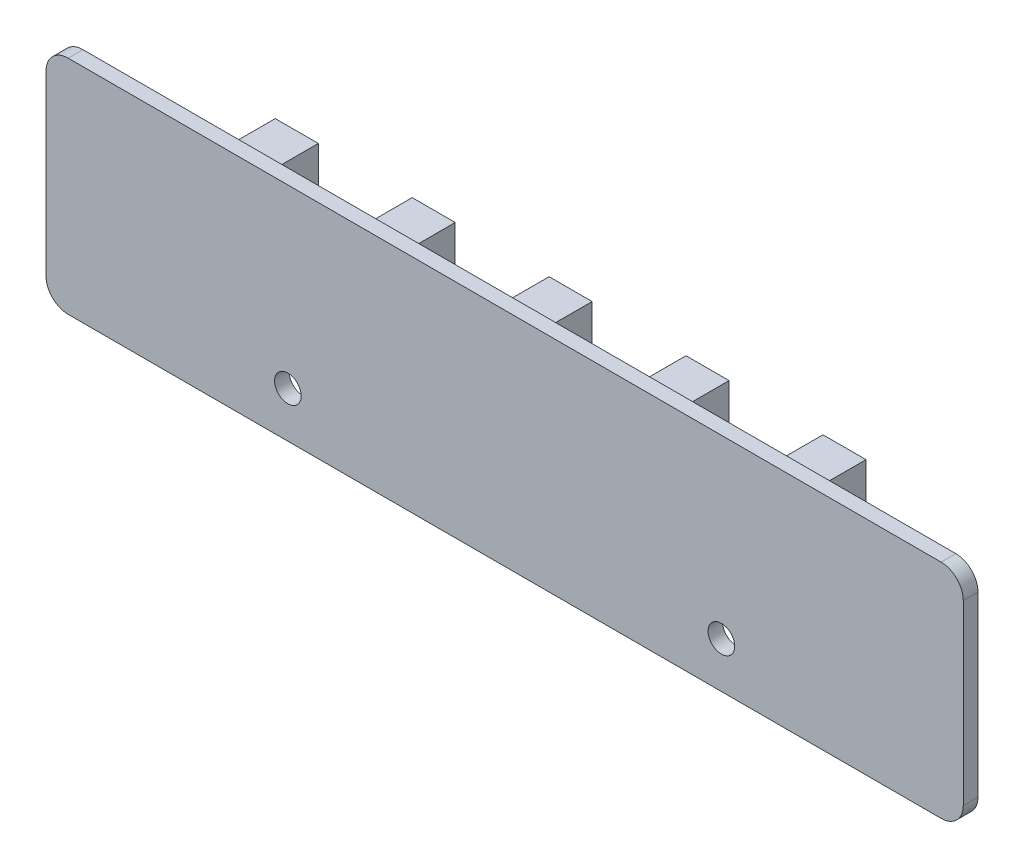
ISO-10303-21;
HEADER;
FILE_DESCRIPTION(('STEP AP214'),'2;1');
FILE_NAME('part.step','',(''),(''),'','','');
FILE_SCHEMA(('AUTOMOTIVE_DESIGN { 1 0 10303 214 1 1 1 1 }'));
ENDSEC;
DATA;
#1=APPLICATION_CONTEXT('core data for automotive mechanical design processes');
#2=APPLICATION_PROTOCOL_DEFINITION('international standard','automotive_design',2000,#1);
#3=PRODUCT_CONTEXT('',#1,'mechanical');
#4=PRODUCT('Part','Part','',(#3));
#5=PRODUCT_RELATED_PRODUCT_CATEGORY('part','',(#4));
#6=PRODUCT_DEFINITION_FORMATION('','',#4);
#7=PRODUCT_DEFINITION_CONTEXT('part definition',#1,'design');
#8=PRODUCT_DEFINITION('design','',#6,#7);
#9=PRODUCT_DEFINITION_SHAPE('','',#8);
#10=(LENGTH_UNIT() NAMED_UNIT(*) SI_UNIT(.MILLI.,.METRE.));
#11=(NAMED_UNIT(*) PLANE_ANGLE_UNIT() SI_UNIT($,.RADIAN.));
#12=(NAMED_UNIT(*) SI_UNIT($,.STERADIAN.) SOLID_ANGLE_UNIT());
#13=UNCERTAINTY_MEASURE_WITH_UNIT(LENGTH_MEASURE(1.E-05),#10,'distance_accuracy_value','');
#14=(GEOMETRIC_REPRESENTATION_CONTEXT(3) GLOBAL_UNCERTAINTY_ASSIGNED_CONTEXT((#13)) GLOBAL_UNIT_ASSIGNED_CONTEXT((#10,
#11,#12)) REPRESENTATION_CONTEXT('',''));
#15=CARTESIAN_POINT('',(0.,0.,0.));
#16=DIRECTION('',(0.,0.,1.));
#17=DIRECTION('',(1.,0.,0.));
#18=AXIS2_PLACEMENT_3D('',#15,#16,#17);
#19=CARTESIAN_POINT('',(-46.628094050939,74.0595570288471,1.99));
#20=DIRECTION('',(0.,0.,1.));
#21=DIRECTION('',(1.,0.,0.));
#22=AXIS2_PLACEMENT_3D('',#19,#20,#21);
#23=PLANE('',#22);
#24=CARTESIAN_POINT('',(-16.928094050939,53.2395570288471,1.99));
#25=DIRECTION('',(0.,0.,-1.));
#26=DIRECTION('',(-1.,0.,0.));
#27=AXIS2_PLACEMENT_3D('',#24,#25,#26);
#28=CIRCLE('',#27,1.8);
#29=CARTESIAN_POINT('',(-18.728094050939,53.2395570288471,1.99));
#30=VERTEX_POINT('',#29);
#31=EDGE_CURVE('E770',#30,#30,#28,.T.);
#32=ORIENTED_EDGE('',*,*,#31,.T.);
#33=EDGE_LOOP('',(#32));
#34=FACE_BOUND('',#33,.T.);
#35=CARTESIAN_POINT('',(-46.628094050939,74.0595570288471,1.99));
#36=DIRECTION('',(0.,0.,1.));
#37=DIRECTION('',(1.,0.,0.));
#38=AXIS2_PLACEMENT_3D('',#35,#36,#37);
#39=CIRCLE('',#38,3.);
#40=CARTESIAN_POINT('',(-46.628094050939,77.0595570288471,1.99));
#41=VERTEX_POINT('',#40);
#42=CARTESIAN_POINT('',(-49.628094050939,74.0595570288471,1.99));
#43=VERTEX_POINT('',#42);
#44=EDGE_CURVE('E382',#41,#43,#39,.T.);
#45=ORIENTED_EDGE('',*,*,#44,.T.);
#46=DIRECTION('',(0.,-1.,0.));
#47=VECTOR('',#46,1.);
#48=CARTESIAN_POINT('',(-49.628094050939,74.0595570288471,1.99));
#49=LINE('',#48,#47);
#50=CARTESIAN_POINT('',(-49.628094050939,50.0595570288472,1.99));
#51=VERTEX_POINT('',#50);
#52=EDGE_CURVE('E385',#43,#51,#49,.T.);
#53=ORIENTED_EDGE('',*,*,#52,.T.);
#54=CARTESIAN_POINT('',(-46.628094050939,50.0595570288471,1.99));
#55=DIRECTION('',(0.,0.,1.));
#56=DIRECTION('',(1.,0.,0.));
#57=AXIS2_PLACEMENT_3D('',#54,#55,#56);
#58=CIRCLE('',#57,3.);
#59=CARTESIAN_POINT('',(-46.6280940509389,47.0595570288471,1.99));
#60=VERTEX_POINT('',#59);
#61=EDGE_CURVE('E388',#51,#60,#58,.T.);
#62=ORIENTED_EDGE('',*,*,#61,.T.);
#63=DIRECTION('',(1.,0.,0.));
#64=VECTOR('',#63,1.);
#65=CARTESIAN_POINT('',(-46.6280940509389,47.0595570288471,1.99));
#66=LINE('',#65,#64);
#67=CARTESIAN_POINT('',(71.371905949061,47.0595570288471,1.99));
#68=VERTEX_POINT('',#67);
#69=EDGE_CURVE('E390',#60,#68,#66,.T.);
#70=ORIENTED_EDGE('',*,*,#69,.T.);
#71=CARTESIAN_POINT('',(71.371905949061,50.0595570288471,1.99));
#72=DIRECTION('',(0.,0.,1.));
#73=DIRECTION('',(1.,0.,0.));
#74=AXIS2_PLACEMENT_3D('',#71,#72,#73);
#75=CIRCLE('',#74,3.);
#76=CARTESIAN_POINT('',(74.371905949061,50.0595570288472,1.99));
#77=VERTEX_POINT('',#76);
#78=EDGE_CURVE('E392',#68,#77,#75,.T.);
#79=ORIENTED_EDGE('',*,*,#78,.T.);
#80=DIRECTION('',(0.,-1.,0.));
#81=VECTOR('',#80,1.);
#82=CARTESIAN_POINT('',(74.371905949061,74.0595570288471,1.99));
#83=LINE('',#82,#81);
#84=CARTESIAN_POINT('',(74.371905949061,74.0595570288471,1.99));
#85=VERTEX_POINT('',#84);
#86=EDGE_CURVE('E394',#85,#77,#83,.T.);
#87=ORIENTED_EDGE('',*,*,#86,.F.);
#88=CARTESIAN_POINT('',(71.371905949061,74.0595570288471,1.99));
#89=DIRECTION('',(0.,0.,-1.));
#90=DIRECTION('',(-1.,0.,0.));
#91=AXIS2_PLACEMENT_3D('',#88,#89,#90);
#92=CIRCLE('',#91,3.);
#93=CARTESIAN_POINT('',(71.371905949061,77.0595570288471,1.99));
#94=VERTEX_POINT('',#93);
#95=EDGE_CURVE('E397',#94,#85,#92,.T.);
#96=ORIENTED_EDGE('',*,*,#95,.F.);
#97=DIRECTION('',(1.,0.,0.));
#98=VECTOR('',#97,1.);
#99=CARTESIAN_POINT('',(-46.628094050939,77.0595570288471,1.99));
#100=LINE('',#99,#98);
#101=EDGE_CURVE('E400',#41,#94,#100,.T.);
#102=ORIENTED_EDGE('',*,*,#101,.F.);
#103=EDGE_LOOP('',(#45,#53,#62,#70,#79,#87,#96,#102));
#104=FACE_BOUND('',#103,.T.);
#105=CARTESIAN_POINT('',(41.671905949061,53.2395570288471,1.99));
#106=DIRECTION('',(0.,0.,-1.));
#107=DIRECTION('',(-1.,0.,0.));
#108=AXIS2_PLACEMENT_3D('',#105,#106,#107);
#109=CIRCLE('',#108,1.8);
#110=CARTESIAN_POINT('',(39.871905949061,53.2395570288471,1.99));
#111=VERTEX_POINT('',#110);
#112=EDGE_CURVE('E780',#111,#111,#109,.T.);
#113=ORIENTED_EDGE('',*,*,#112,.T.);
#114=EDGE_LOOP('',(#113));
#115=FACE_BOUND('',#114,.T.);
#116=ADVANCED_FACE('F38',(#34,#104,#115),#23,.T.);
#117=CARTESIAN_POINT('',(-46.628094050939,74.0595570288471,0.));
#118=DIRECTION('',(0.,0.,1.));
#119=DIRECTION('',(1.,0.,0.));
#120=AXIS2_PLACEMENT_3D('',#117,#118,#119);
#121=PLANE('',#120);
#122=CARTESIAN_POINT('',(-16.928094050939,53.2395570288471,0.));
#123=DIRECTION('',(0.,0.,-1.));
#124=DIRECTION('',(-1.,0.,0.));
#125=AXIS2_PLACEMENT_3D('',#122,#123,#124);
#126=CIRCLE('',#125,1.8);
#127=CARTESIAN_POINT('',(-18.728094050939,53.2395570288471,0.));
#128=VERTEX_POINT('',#127);
#129=EDGE_CURVE('E773',#128,#128,#126,.T.);
#130=ORIENTED_EDGE('',*,*,#129,.F.);
#131=EDGE_LOOP('',(#130));
#132=FACE_BOUND('',#131,.T.);
#133=CARTESIAN_POINT('',(41.671905949061,53.2395570288471,0.));
#134=DIRECTION('',(0.,0.,-1.));
#135=DIRECTION('',(-1.,0.,0.));
#136=AXIS2_PLACEMENT_3D('',#133,#134,#135);
#137=CIRCLE('',#136,1.8);
#138=CARTESIAN_POINT('',(39.871905949061,53.2395570288471,0.));
#139=VERTEX_POINT('',#138);
#140=EDGE_CURVE('E775',#139,#139,#137,.T.);
#141=ORIENTED_EDGE('',*,*,#140,.F.);
#142=EDGE_LOOP('',(#141));
#143=FACE_BOUND('',#142,.T.);
#144=DIRECTION('',(0.,-1.,0.));
#145=VECTOR('',#144,1.);
#146=CARTESIAN_POINT('',(33.790905949061,75.0595570288471,0.));
#147=LINE('',#146,#145);
#148=CARTESIAN_POINT('',(33.790905949061,75.0595570288471,0.));
#149=VERTEX_POINT('',#148);
#150=CARTESIAN_POINT('',(33.790905949061,65.4295570288471,0.));
#151=VERTEX_POINT('',#150);
#152=EDGE_CURVE('E279',#149,#151,#147,.T.);
#153=ORIENTED_EDGE('',*,*,#152,.F.);
#154=DIRECTION('',(1.,0.,0.));
#155=VECTOR('',#154,1.);
#156=CARTESIAN_POINT('',(33.790905949061,75.0595570288471,0.));
#157=LINE('',#156,#155);
#158=CARTESIAN_POINT('',(27.970905949061,75.0595570288471,0.));
#159=VERTEX_POINT('',#158);
#160=EDGE_CURVE('E245',#159,#149,#157,.T.);
#161=ORIENTED_EDGE('',*,*,#160,.F.);
#162=DIRECTION('',(0.,1.,0.));
#163=VECTOR('',#162,1.);
#164=CARTESIAN_POINT('',(27.970905949061,75.0595570288471,0.));
#165=LINE('',#164,#163);
#166=CARTESIAN_POINT('',(27.970905949061,65.4295570288471,0.));
#167=VERTEX_POINT('',#166);
#168=EDGE_CURVE('E267',#167,#159,#165,.T.);
#169=ORIENTED_EDGE('',*,*,#168,.F.);
#170=DIRECTION('',(-1.,0.,0.));
#171=VECTOR('',#170,1.);
#172=CARTESIAN_POINT('',(33.790905949061,65.4295570288471,0.));
#173=LINE('',#172,#171);
#174=EDGE_CURVE('E273',#151,#167,#173,.T.);
#175=ORIENTED_EDGE('',*,*,#174,.F.);
#176=EDGE_LOOP('',(#153,#161,#169,#175));
#177=FACE_BOUND('',#176,.T.);
#178=DIRECTION('',(0.,-1.,0.));
#179=VECTOR('',#178,1.);
#180=CARTESIAN_POINT('',(-3.22709405093898,75.0595570288471,0.));
#181=LINE('',#180,#179);
#182=CARTESIAN_POINT('',(-3.22709405093898,75.0595570288471,0.));
#183=VERTEX_POINT('',#182);
#184=CARTESIAN_POINT('',(-3.22709405093898,65.4295570288471,0.));
#185=VERTEX_POINT('',#184);
#186=EDGE_CURVE('E345',#183,#185,#181,.T.);
#187=ORIENTED_EDGE('',*,*,#186,.F.);
#188=DIRECTION('',(1.,0.,0.));
#189=VECTOR('',#188,1.);
#190=CARTESIAN_POINT('',(-3.22709405093898,75.0595570288471,0.));
#191=LINE('',#190,#189);
#192=CARTESIAN_POINT('',(-9.04709405093898,75.0595570288471,0.));
#193=VERTEX_POINT('',#192);
#194=EDGE_CURVE('E315',#193,#183,#191,.T.);
#195=ORIENTED_EDGE('',*,*,#194,.F.);
#196=DIRECTION('',(0.,1.,0.));
#197=VECTOR('',#196,1.);
#198=CARTESIAN_POINT('',(-9.04709405093898,75.0595570288471,0.));
#199=LINE('',#198,#197);
#200=CARTESIAN_POINT('',(-9.04709405093898,65.4295570288471,0.));
#201=VERTEX_POINT('',#200);
#202=EDGE_CURVE('E333',#201,#193,#199,.T.);
#203=ORIENTED_EDGE('',*,*,#202,.F.);
#204=DIRECTION('',(-1.,0.,0.));
#205=VECTOR('',#204,1.);
#206=CARTESIAN_POINT('',(-3.22709405093898,65.4295570288471,0.));
#207=LINE('',#206,#205);
#208=EDGE_CURVE('E339',#185,#201,#207,.T.);
#209=ORIENTED_EDGE('',*,*,#208,.F.);
#210=EDGE_LOOP('',(#187,#195,#203,#209));
#211=FACE_BOUND('',#210,.T.);
#212=CARTESIAN_POINT('',(-46.628094050939,74.0595570288471,0.));
#213=DIRECTION('',(0.,0.,1.));
#214=DIRECTION('',(1.,0.,0.));
#215=AXIS2_PLACEMENT_3D('',#212,#213,#214);
#216=CIRCLE('',#215,3.);
#217=CARTESIAN_POINT('',(-46.628094050939,77.0595570288471,0.));
#218=VERTEX_POINT('',#217);
#219=CARTESIAN_POINT('',(-49.628094050939,74.0595570288471,0.));
#220=VERTEX_POINT('',#219);
#221=EDGE_CURVE('E381',#218,#220,#216,.T.);
#222=ORIENTED_EDGE('',*,*,#221,.F.);
#223=DIRECTION('',(1.,0.,0.));
#224=VECTOR('',#223,1.);
#225=CARTESIAN_POINT('',(-46.628094050939,77.0595570288471,0.));
#226=LINE('',#225,#224);
#227=CARTESIAN_POINT('',(71.371905949061,77.0595570288471,0.));
#228=VERTEX_POINT('',#227);
#229=EDGE_CURVE('E386',#218,#228,#226,.T.);
#230=ORIENTED_EDGE('',*,*,#229,.T.);
#231=CARTESIAN_POINT('',(71.371905949061,74.0595570288471,0.));
#232=DIRECTION('',(0.,0.,-1.));
#233=DIRECTION('',(-1.,0.,0.));
#234=AXIS2_PLACEMENT_3D('',#231,#232,#233);
#235=CIRCLE('',#234,3.);
#236=CARTESIAN_POINT('',(74.371905949061,74.0595570288471,0.));
#237=VERTEX_POINT('',#236);
#238=EDGE_CURVE('E418',#228,#237,#235,.T.);
#239=ORIENTED_EDGE('',*,*,#238,.T.);
#240=DIRECTION('',(0.,-1.,0.));
#241=VECTOR('',#240,1.);
#242=CARTESIAN_POINT('',(74.371905949061,74.0595570288471,0.));
#243=LINE('',#242,#241);
#244=CARTESIAN_POINT('',(74.371905949061,50.0595570288472,0.));
#245=VERTEX_POINT('',#244);
#246=EDGE_CURVE('E415',#237,#245,#243,.T.);
#247=ORIENTED_EDGE('',*,*,#246,.T.);
#248=CARTESIAN_POINT('',(71.371905949061,50.0595570288471,0.));
#249=DIRECTION('',(0.,0.,1.));
#250=DIRECTION('',(1.,0.,0.));
#251=AXIS2_PLACEMENT_3D('',#248,#249,#250);
#252=CIRCLE('',#251,3.);
#253=CARTESIAN_POINT('',(71.371905949061,47.0595570288471,0.));
#254=VERTEX_POINT('',#253);
#255=EDGE_CURVE('E412',#254,#245,#252,.T.);
#256=ORIENTED_EDGE('',*,*,#255,.F.);
#257=DIRECTION('',(1.,0.,0.));
#258=VECTOR('',#257,1.);
#259=CARTESIAN_POINT('',(-46.6280940509389,47.0595570288471,0.));
#260=LINE('',#259,#258);
#261=CARTESIAN_POINT('',(-46.6280940509389,47.0595570288471,0.));
#262=VERTEX_POINT('',#261);
#263=EDGE_CURVE('E410',#262,#254,#260,.T.);
#264=ORIENTED_EDGE('',*,*,#263,.F.);
#265=CARTESIAN_POINT('',(-46.628094050939,50.0595570288471,0.));
#266=DIRECTION('',(0.,0.,1.));
#267=DIRECTION('',(1.,0.,0.));
#268=AXIS2_PLACEMENT_3D('',#265,#266,#267);
#269=CIRCLE('',#268,3.);
#270=CARTESIAN_POINT('',(-49.628094050939,50.0595570288472,0.));
#271=VERTEX_POINT('',#270);
#272=EDGE_CURVE('E408',#271,#262,#269,.T.);
#273=ORIENTED_EDGE('',*,*,#272,.F.);
#274=DIRECTION('',(0.,-1.,0.));
#275=VECTOR('',#274,1.);
#276=CARTESIAN_POINT('',(-49.628094050939,74.0595570288471,0.));
#277=LINE('',#276,#275);
#278=EDGE_CURVE('E406',#220,#271,#277,.T.);
#279=ORIENTED_EDGE('',*,*,#278,.F.);
#280=EDGE_LOOP('',(#222,#230,#239,#247,#256,#264,#273,#279));
#281=FACE_BOUND('',#280,.T.);
#282=DIRECTION('',(0.,-1.,0.));
#283=VECTOR('',#282,1.);
#284=CARTESIAN_POINT('',(15.281905949061,75.0595570288471,0.));
#285=LINE('',#284,#283);
#286=CARTESIAN_POINT('',(15.281905949061,75.0595570288471,0.));
#287=VERTEX_POINT('',#286);
#288=CARTESIAN_POINT('',(15.281905949061,65.4295570288471,0.));
#289=VERTEX_POINT('',#288);
#290=EDGE_CURVE('E348',#287,#289,#285,.T.);
#291=ORIENTED_EDGE('',*,*,#290,.F.);
#292=DIRECTION('',(1.,0.,0.));
#293=VECTOR('',#292,1.);
#294=CARTESIAN_POINT('',(15.281905949061,75.0595570288471,0.));
#295=LINE('',#294,#293);
#296=CARTESIAN_POINT('',(9.46190594906102,75.0595570288471,0.));
#297=VERTEX_POINT('',#296);
#298=EDGE_CURVE('E353',#297,#287,#295,.T.);
#299=ORIENTED_EDGE('',*,*,#298,.F.);
#300=DIRECTION('',(0.,1.,0.));
#301=VECTOR('',#300,1.);
#302=CARTESIAN_POINT('',(9.46190594906102,75.0595570288471,0.));
#303=LINE('',#302,#301);
#304=CARTESIAN_POINT('',(9.46190594906102,65.4295570288471,0.));
#305=VERTEX_POINT('',#304);
#306=EDGE_CURVE('E365',#305,#297,#303,.T.);
#307=ORIENTED_EDGE('',*,*,#306,.F.);
#308=DIRECTION('',(-1.,0.,0.));
#309=VECTOR('',#308,1.);
#310=CARTESIAN_POINT('',(15.281905949061,65.4295570288471,0.));
#311=LINE('',#310,#309);
#312=EDGE_CURVE('E362',#289,#305,#311,.T.);
#313=ORIENTED_EDGE('',*,*,#312,.F.);
#314=EDGE_LOOP('',(#291,#299,#307,#313));
#315=FACE_BOUND('',#314,.T.);
#316=DIRECTION('',(0.,-1.,0.));
#317=VECTOR('',#316,1.);
#318=CARTESIAN_POINT('',(-21.736094050939,75.0595570288471,0.));
#319=LINE('',#318,#317);
#320=CARTESIAN_POINT('',(-21.736094050939,75.0595570288471,0.));
#321=VERTEX_POINT('',#320);
#322=CARTESIAN_POINT('',(-21.736094050939,65.4295570288471,0.));
#323=VERTEX_POINT('',#322);
#324=EDGE_CURVE('E312',#321,#323,#319,.T.);
#325=ORIENTED_EDGE('',*,*,#324,.F.);
#326=DIRECTION('',(1.,0.,0.));
#327=VECTOR('',#326,1.);
#328=CARTESIAN_POINT('',(-21.736094050939,75.0595570288471,0.));
#329=LINE('',#328,#327);
#330=CARTESIAN_POINT('',(-27.556094050939,75.0595570288471,0.));
#331=VERTEX_POINT('',#330);
#332=EDGE_CURVE('E282',#331,#321,#329,.T.);
#333=ORIENTED_EDGE('',*,*,#332,.F.);
#334=DIRECTION('',(0.,1.,0.));
#335=VECTOR('',#334,1.);
#336=CARTESIAN_POINT('',(-27.556094050939,75.0595570288471,0.));
#337=LINE('',#336,#335);
#338=CARTESIAN_POINT('',(-27.556094050939,65.4295570288471,0.));
#339=VERTEX_POINT('',#338);
#340=EDGE_CURVE('E300',#339,#331,#337,.T.);
#341=ORIENTED_EDGE('',*,*,#340,.F.);
#342=DIRECTION('',(-1.,0.,0.));
#343=VECTOR('',#342,1.);
#344=CARTESIAN_POINT('',(-21.736094050939,65.4295570288471,0.));
#345=LINE('',#344,#343);
#346=EDGE_CURVE('E306',#323,#339,#345,.T.);
#347=ORIENTED_EDGE('',*,*,#346,.F.);
#348=EDGE_LOOP('',(#325,#333,#341,#347));
#349=FACE_BOUND('',#348,.T.);
#350=DIRECTION('',(0.,-1.,0.));
#351=VECTOR('',#350,1.);
#352=CARTESIAN_POINT('',(52.299905949061,75.0595570288471,0.));
#353=LINE('',#352,#351);
#354=CARTESIAN_POINT('',(52.299905949061,75.0595570288471,0.));
#355=VERTEX_POINT('',#354);
#356=CARTESIAN_POINT('',(52.299905949061,65.4295570288471,0.));
#357=VERTEX_POINT('',#356);
#358=EDGE_CURVE('E243',#355,#357,#353,.T.);
#359=ORIENTED_EDGE('',*,*,#358,.F.);
#360=DIRECTION('',(1.,0.,0.));
#361=VECTOR('',#360,1.);
#362=CARTESIAN_POINT('',(52.299905949061,75.0595570288471,0.));
#363=LINE('',#362,#361);
#364=CARTESIAN_POINT('',(46.479905949061,75.0595570288471,0.));
#365=VERTEX_POINT('',#364);
#366=EDGE_CURVE('E232',#365,#355,#363,.T.);
#367=ORIENTED_EDGE('',*,*,#366,.F.);
#368=DIRECTION('',(0.,1.,0.));
#369=VECTOR('',#368,1.);
#370=CARTESIAN_POINT('',(46.479905949061,75.0595570288471,0.));
#371=LINE('',#370,#369);
#372=CARTESIAN_POINT('',(46.479905949061,65.4295570288471,0.));
#373=VERTEX_POINT('',#372);
#374=EDGE_CURVE('E58',#373,#365,#371,.T.);
#375=ORIENTED_EDGE('',*,*,#374,.F.);
#376=DIRECTION('',(-1.,0.,0.));
#377=VECTOR('',#376,1.);
#378=CARTESIAN_POINT('',(52.299905949061,65.4295570288471,0.));
#379=LINE('',#378,#377);
#380=EDGE_CURVE('E53',#357,#373,#379,.T.);
#381=ORIENTED_EDGE('',*,*,#380,.F.);
#382=EDGE_LOOP('',(#359,#367,#375,#381));
#383=FACE_BOUND('',#382,.T.);
#384=ADVANCED_FACE('F446',(#132,#143,#177,#211,#281,#315,#349,#383),#121,.F.);
#385=CARTESIAN_POINT('',(-46.628094050939,74.0595570288471,1.99));
#386=DIRECTION('',(0.,0.,-1.));
#387=DIRECTION('',(-1.,0.,0.));
#388=AXIS2_PLACEMENT_3D('',#385,#386,#387);
#389=CYLINDRICAL_SURFACE('',#388,3.);
#390=ORIENTED_EDGE('',*,*,#221,.T.);
#391=DIRECTION('',(0.,0.,-1.));
#392=VECTOR('',#391,1.);
#393=CARTESIAN_POINT('',(-49.628094050939,74.0595570288471,1.99));
#394=LINE('',#393,#392);
#395=EDGE_CURVE('E11',#43,#220,#394,.T.);
#396=ORIENTED_EDGE('',*,*,#395,.F.);
#397=ORIENTED_EDGE('',*,*,#44,.F.);
#398=DIRECTION('',(0.,0.,-1.));
#399=VECTOR('',#398,1.);
#400=CARTESIAN_POINT('',(-46.628094050939,77.0595570288471,1.99));
#401=LINE('',#400,#399);
#402=EDGE_CURVE('E403',#41,#218,#401,.T.);
#403=ORIENTED_EDGE('',*,*,#402,.T.);
#404=EDGE_LOOP('',(#390,#396,#397,#403));
#405=FACE_BOUND('',#404,.T.);
#406=ADVANCED_FACE('F40',(#405),#389,.T.);
#407=CARTESIAN_POINT('',(-49.628094050939,74.0595570288471,1.99));
#408=DIRECTION('',(1.,0.,0.));
#409=DIRECTION('',(0.,1.,0.));
#410=AXIS2_PLACEMENT_3D('',#407,#408,#409);
#411=PLANE('',#410);
#412=ORIENTED_EDGE('',*,*,#278,.T.);
#413=DIRECTION('',(0.,0.,-1.));
#414=VECTOR('',#413,1.);
#415=CARTESIAN_POINT('',(-49.628094050939,50.0595570288472,1.99));
#416=LINE('',#415,#414);
#417=EDGE_CURVE('E46',#51,#271,#416,.T.);
#418=ORIENTED_EDGE('',*,*,#417,.F.);
#419=ORIENTED_EDGE('',*,*,#52,.F.);
#420=ORIENTED_EDGE('',*,*,#395,.T.);
#421=EDGE_LOOP('',(#412,#418,#419,#420));
#422=FACE_BOUND('',#421,.T.);
#423=ADVANCED_FACE('F464',(#422),#411,.F.);
#424=CARTESIAN_POINT('',(-46.628094050939,50.0595570288471,1.99));
#425=DIRECTION('',(0.,0.,-1.));
#426=DIRECTION('',(-1.,0.,0.));
#427=AXIS2_PLACEMENT_3D('',#424,#425,#426);
#428=CYLINDRICAL_SURFACE('',#427,3.);
#429=ORIENTED_EDGE('',*,*,#272,.T.);
#430=DIRECTION('',(0.,0.,-1.));
#431=VECTOR('',#430,1.);
#432=CARTESIAN_POINT('',(-46.6280940509389,47.0595570288471,1.99));
#433=LINE('',#432,#431);
#434=EDGE_CURVE('E433',#60,#262,#433,.T.);
#435=ORIENTED_EDGE('',*,*,#434,.F.);
#436=ORIENTED_EDGE('',*,*,#61,.F.);
#437=ORIENTED_EDGE('',*,*,#417,.T.);
#438=EDGE_LOOP('',(#429,#435,#436,#437));
#439=FACE_BOUND('',#438,.T.);
#440=ADVANCED_FACE('F440',(#439),#428,.T.);
#441=CARTESIAN_POINT('',(-46.6280940509389,47.0595570288471,1.99));
#442=DIRECTION('',(0.,1.,0.));
#443=DIRECTION('',(0.,0.,1.));
#444=AXIS2_PLACEMENT_3D('',#441,#442,#443);
#445=PLANE('',#444);
#446=ORIENTED_EDGE('',*,*,#263,.T.);
#447=DIRECTION('',(0.,0.,-1.));
#448=VECTOR('',#447,1.);
#449=CARTESIAN_POINT('',(71.371905949061,47.0595570288471,1.99));
#450=LINE('',#449,#448);
#451=EDGE_CURVE('E430',#68,#254,#450,.T.);
#452=ORIENTED_EDGE('',*,*,#451,.F.);
#453=ORIENTED_EDGE('',*,*,#69,.F.);
#454=ORIENTED_EDGE('',*,*,#434,.T.);
#455=EDGE_LOOP('',(#446,#452,#453,#454));
#456=FACE_BOUND('',#455,.T.);
#457=ADVANCED_FACE('F451',(#456),#445,.F.);
#458=CARTESIAN_POINT('',(71.371905949061,50.0595570288471,1.99));
#459=DIRECTION('',(0.,0.,-1.));
#460=DIRECTION('',(-1.,0.,0.));
#461=AXIS2_PLACEMENT_3D('',#458,#459,#460);
#462=CYLINDRICAL_SURFACE('',#461,3.);
#463=ORIENTED_EDGE('',*,*,#255,.T.);
#464=DIRECTION('',(0.,0.,-1.));
#465=VECTOR('',#464,1.);
#466=CARTESIAN_POINT('',(74.371905949061,50.0595570288472,1.99));
#467=LINE('',#466,#465);
#468=EDGE_CURVE('E428',#77,#245,#467,.T.);
#469=ORIENTED_EDGE('',*,*,#468,.F.);
#470=ORIENTED_EDGE('',*,*,#78,.F.);
#471=ORIENTED_EDGE('',*,*,#451,.T.);
#472=EDGE_LOOP('',(#463,#469,#470,#471));
#473=FACE_BOUND('',#472,.T.);
#474=ADVANCED_FACE('F455',(#473),#462,.T.);
#475=CARTESIAN_POINT('',(74.371905949061,74.0595570288471,1.99));
#476=DIRECTION('',(1.,0.,0.));
#477=DIRECTION('',(0.,1.,0.));
#478=AXIS2_PLACEMENT_3D('',#475,#476,#477);
#479=PLANE('',#478);
#480=ORIENTED_EDGE('',*,*,#246,.F.);
#481=DIRECTION('',(0.,0.,-1.));
#482=VECTOR('',#481,1.);
#483=CARTESIAN_POINT('',(74.371905949061,74.0595570288471,1.99));
#484=LINE('',#483,#482);
#485=EDGE_CURVE('E426',#85,#237,#484,.T.);
#486=ORIENTED_EDGE('',*,*,#485,.F.);
#487=ORIENTED_EDGE('',*,*,#86,.T.);
#488=ORIENTED_EDGE('',*,*,#468,.T.);
#489=EDGE_LOOP('',(#480,#486,#487,#488));
#490=FACE_BOUND('',#489,.T.);
#491=ADVANCED_FACE('F474',(#490),#479,.T.);
#492=CARTESIAN_POINT('',(71.371905949061,74.0595570288471,1.99));
#493=DIRECTION('',(0.,0.,-1.));
#494=DIRECTION('',(-1.,0.,0.));
#495=AXIS2_PLACEMENT_3D('',#492,#493,#494);
#496=CYLINDRICAL_SURFACE('',#495,3.);
#497=ORIENTED_EDGE('',*,*,#238,.F.);
#498=DIRECTION('',(0.,0.,-1.));
#499=VECTOR('',#498,1.);
#500=CARTESIAN_POINT('',(71.371905949061,77.0595570288471,1.99));
#501=LINE('',#500,#499);
#502=EDGE_CURVE('E424',#94,#228,#501,.T.);
#503=ORIENTED_EDGE('',*,*,#502,.F.);
#504=ORIENTED_EDGE('',*,*,#95,.T.);
#505=ORIENTED_EDGE('',*,*,#485,.T.);
#506=EDGE_LOOP('',(#497,#503,#504,#505));
#507=FACE_BOUND('',#506,.T.);
#508=ADVANCED_FACE('F471',(#507),#496,.T.);
#509=CARTESIAN_POINT('',(-46.628094050939,77.0595570288471,1.99));
#510=DIRECTION('',(0.,1.,0.));
#511=DIRECTION('',(0.,0.,1.));
#512=AXIS2_PLACEMENT_3D('',#509,#510,#511);
#513=PLANE('',#512);
#514=ORIENTED_EDGE('',*,*,#229,.F.);
#515=ORIENTED_EDGE('',*,*,#402,.F.);
#516=ORIENTED_EDGE('',*,*,#101,.T.);
#517=ORIENTED_EDGE('',*,*,#502,.T.);
#518=EDGE_LOOP('',(#514,#515,#516,#517));
#519=FACE_BOUND('',#518,.T.);
#520=ADVANCED_FACE('F468',(#519),#513,.T.);
#521=CARTESIAN_POINT('',(15.281905949061,75.0595570288471,-6.93));
#522=DIRECTION('',(-1.,0.,0.));
#523=DIRECTION('',(0.,-1.,0.));
#524=AXIS2_PLACEMENT_3D('',#521,#522,#523);
#525=PLANE('',#524);
#526=ORIENTED_EDGE('',*,*,#290,.T.);
#527=DIRECTION('',(0.,0.,1.));
#528=VECTOR('',#527,1.);
#529=CARTESIAN_POINT('',(15.281905949061,65.4295570288471,-6.93));
#530=LINE('',#529,#528);
#531=CARTESIAN_POINT('',(15.281905949061,65.4295570288471,-6.93));
#532=VERTEX_POINT('',#531);
#533=EDGE_CURVE('E378',#532,#289,#530,.T.);
#534=ORIENTED_EDGE('',*,*,#533,.F.);
#535=DIRECTION('',(0.,-1.,0.));
#536=VECTOR('',#535,1.);
#537=CARTESIAN_POINT('',(15.281905949061,75.0595570288471,-6.93));
#538=LINE('',#537,#536);
#539=CARTESIAN_POINT('',(15.281905949061,75.0595570288471,-6.93));
#540=VERTEX_POINT('',#539);
#541=EDGE_CURVE('E349',#540,#532,#538,.T.);
#542=ORIENTED_EDGE('',*,*,#541,.F.);
#543=DIRECTION('',(0.,0.,1.));
#544=VECTOR('',#543,1.);
#545=CARTESIAN_POINT('',(15.281905949061,75.0595570288471,-6.93));
#546=LINE('',#545,#544);
#547=EDGE_CURVE('E359',#540,#287,#546,.T.);
#548=ORIENTED_EDGE('',*,*,#547,.T.);
#549=EDGE_LOOP('',(#526,#534,#542,#548));
#550=FACE_BOUND('',#549,.T.);
#551=ADVANCED_FACE('F494',(#550),#525,.F.);
#552=CARTESIAN_POINT('',(15.281905949061,65.4295570288471,-6.93));
#553=DIRECTION('',(0.,1.,0.));
#554=DIRECTION('',(0.,0.,1.));
#555=AXIS2_PLACEMENT_3D('',#552,#553,#554);
#556=PLANE('',#555);
#557=ORIENTED_EDGE('',*,*,#312,.T.);
#558=DIRECTION('',(0.,0.,1.));
#559=VECTOR('',#558,1.);
#560=CARTESIAN_POINT('',(9.46190594906102,65.4295570288471,-6.93));
#561=LINE('',#560,#559);
#562=CARTESIAN_POINT('',(9.46190594906102,65.4295570288471,-6.93));
#563=VERTEX_POINT('',#562);
#564=EDGE_CURVE('E375',#563,#305,#561,.T.);
#565=ORIENTED_EDGE('',*,*,#564,.F.);
#566=DIRECTION('',(-1.,0.,0.));
#567=VECTOR('',#566,1.);
#568=CARTESIAN_POINT('',(15.281905949061,65.4295570288471,-6.93));
#569=LINE('',#568,#567);
#570=EDGE_CURVE('E352',#532,#563,#569,.T.);
#571=ORIENTED_EDGE('',*,*,#570,.F.);
#572=ORIENTED_EDGE('',*,*,#533,.T.);
#573=EDGE_LOOP('',(#557,#565,#571,#572));
#574=FACE_BOUND('',#573,.T.);
#575=ADVANCED_FACE('F501',(#574),#556,.F.);
#576=CARTESIAN_POINT('',(9.46190594906102,75.0595570288471,-6.93));
#577=DIRECTION('',(1.,0.,0.));
#578=DIRECTION('',(0.,1.,0.));
#579=AXIS2_PLACEMENT_3D('',#576,#577,#578);
#580=PLANE('',#579);
#581=ORIENTED_EDGE('',*,*,#306,.T.);
#582=DIRECTION('',(0.,0.,1.));
#583=VECTOR('',#582,1.);
#584=CARTESIAN_POINT('',(9.46190594906102,75.0595570288471,-6.93));
#585=LINE('',#584,#583);
#586=CARTESIAN_POINT('',(9.46190594906102,75.0595570288471,-6.93));
#587=VERTEX_POINT('',#586);
#588=EDGE_CURVE('E372',#587,#297,#585,.T.);
#589=ORIENTED_EDGE('',*,*,#588,.F.);
#590=DIRECTION('',(0.,1.,0.));
#591=VECTOR('',#590,1.);
#592=CARTESIAN_POINT('',(9.46190594906102,75.0595570288471,-6.93));
#593=LINE('',#592,#591);
#594=EDGE_CURVE('E355',#563,#587,#593,.T.);
#595=ORIENTED_EDGE('',*,*,#594,.F.);
#596=ORIENTED_EDGE('',*,*,#564,.T.);
#597=EDGE_LOOP('',(#581,#589,#595,#596));
#598=FACE_BOUND('',#597,.T.);
#599=ADVANCED_FACE('F506',(#598),#580,.F.);
#600=CARTESIAN_POINT('',(15.281905949061,75.0595570288471,-6.93));
#601=DIRECTION('',(0.,-1.,0.));
#602=DIRECTION('',(0.,0.,-1.));
#603=AXIS2_PLACEMENT_3D('',#600,#601,#602);
#604=PLANE('',#603);
#605=ORIENTED_EDGE('',*,*,#298,.T.);
#606=ORIENTED_EDGE('',*,*,#547,.F.);
#607=DIRECTION('',(1.,0.,0.));
#608=VECTOR('',#607,1.);
#609=CARTESIAN_POINT('',(15.281905949061,75.0595570288471,-6.93));
#610=LINE('',#609,#608);
#611=EDGE_CURVE('E357',#587,#540,#610,.T.);
#612=ORIENTED_EDGE('',*,*,#611,.F.);
#613=ORIENTED_EDGE('',*,*,#588,.T.);
#614=EDGE_LOOP('',(#605,#606,#612,#613));
#615=FACE_BOUND('',#614,.T.);
#616=ADVANCED_FACE('F513',(#615),#604,.F.);
#617=CARTESIAN_POINT('',(0.,0.,-6.93));
#618=DIRECTION('',(0.,0.,-1.));
#619=DIRECTION('',(-1.,0.,0.));
#620=AXIS2_PLACEMENT_3D('',#617,#618,#619);
#621=PLANE('',#620);
#622=ORIENTED_EDGE('',*,*,#541,.T.);
#623=ORIENTED_EDGE('',*,*,#570,.T.);
#624=ORIENTED_EDGE('',*,*,#594,.T.);
#625=ORIENTED_EDGE('',*,*,#611,.T.);
#626=EDGE_LOOP('',(#622,#623,#624,#625));
#627=FACE_BOUND('',#626,.T.);
#628=ADVANCED_FACE('F520',(#627),#621,.T.);
#629=CARTESIAN_POINT('',(-3.22709405093898,75.0595570288471,-6.93));
#630=DIRECTION('',(-1.,0.,0.));
#631=DIRECTION('',(0.,-1.,0.));
#632=AXIS2_PLACEMENT_3D('',#629,#630,#631);
#633=PLANE('',#632);
#634=ORIENTED_EDGE('',*,*,#186,.T.);
#635=DIRECTION('',(0.,0.,1.));
#636=VECTOR('',#635,1.);
#637=CARTESIAN_POINT('',(-3.22709405093898,65.4295570288471,-6.93));
#638=LINE('',#637,#636);
#639=CARTESIAN_POINT('',(-3.22709405093898,65.4295570288471,-6.93));
#640=VERTEX_POINT('',#639);
#641=EDGE_CURVE('E342',#640,#185,#638,.T.);
#642=ORIENTED_EDGE('',*,*,#641,.F.);
#643=DIRECTION('',(0.,-1.,0.));
#644=VECTOR('',#643,1.);
#645=CARTESIAN_POINT('',(-3.22709405093898,75.0595570288471,-6.93));
#646=LINE('',#645,#644);
#647=CARTESIAN_POINT('',(-3.22709405093898,75.0595570288471,-6.93));
#648=VERTEX_POINT('',#647);
#649=EDGE_CURVE('E318',#648,#640,#646,.T.);
#650=ORIENTED_EDGE('',*,*,#649,.F.);
#651=DIRECTION('',(0.,0.,1.));
#652=VECTOR('',#651,1.);
#653=CARTESIAN_POINT('',(-3.22709405093898,75.0595570288471,-6.93));
#654=LINE('',#653,#652);
#655=EDGE_CURVE('E327',#648,#183,#654,.T.);
#656=ORIENTED_EDGE('',*,*,#655,.T.);
#657=EDGE_LOOP('',(#634,#642,#650,#656));
#658=FACE_BOUND('',#657,.T.);
#659=ADVANCED_FACE('F522',(#658),#633,.F.);
#660=CARTESIAN_POINT('',(-3.22709405093898,65.4295570288471,-6.93));
#661=DIRECTION('',(0.,1.,0.));
#662=DIRECTION('',(0.,0.,1.));
#663=AXIS2_PLACEMENT_3D('',#660,#661,#662);
#664=PLANE('',#663);
#665=ORIENTED_EDGE('',*,*,#208,.T.);
#666=DIRECTION('',(0.,0.,1.));
#667=VECTOR('',#666,1.);
#668=CARTESIAN_POINT('',(-9.04709405093898,65.4295570288471,-6.93));
#669=LINE('',#668,#667);
#670=CARTESIAN_POINT('',(-9.04709405093898,65.4295570288471,-6.93));
#671=VERTEX_POINT('',#670);
#672=EDGE_CURVE('E336',#671,#201,#669,.T.);
#673=ORIENTED_EDGE('',*,*,#672,.F.);
#674=DIRECTION('',(-1.,0.,0.));
#675=VECTOR('',#674,1.);
#676=CARTESIAN_POINT('',(-3.22709405093898,65.4295570288471,-6.93));
#677=LINE('',#676,#675);
#678=EDGE_CURVE('E320',#640,#671,#677,.T.);
#679=ORIENTED_EDGE('',*,*,#678,.F.);
#680=ORIENTED_EDGE('',*,*,#641,.T.);
#681=EDGE_LOOP('',(#665,#673,#679,#680));
#682=FACE_BOUND('',#681,.T.);
#683=ADVANCED_FACE('F528',(#682),#664,.F.);
#684=CARTESIAN_POINT('',(-9.04709405093898,75.0595570288471,-6.93));
#685=DIRECTION('',(1.,0.,0.));
#686=DIRECTION('',(0.,1.,0.));
#687=AXIS2_PLACEMENT_3D('',#684,#685,#686);
#688=PLANE('',#687);
#689=ORIENTED_EDGE('',*,*,#202,.T.);
#690=DIRECTION('',(0.,0.,1.));
#691=VECTOR('',#690,1.);
#692=CARTESIAN_POINT('',(-9.04709405093898,75.0595570288471,-6.93));
#693=LINE('',#692,#691);
#694=CARTESIAN_POINT('',(-9.04709405093898,75.0595570288471,-6.93));
#695=VERTEX_POINT('',#694);
#696=EDGE_CURVE('E330',#695,#193,#693,.T.);
#697=ORIENTED_EDGE('',*,*,#696,.F.);
#698=DIRECTION('',(0.,1.,0.));
#699=VECTOR('',#698,1.);
#700=CARTESIAN_POINT('',(-9.04709405093898,75.0595570288471,-6.93));
#701=LINE('',#700,#699);
#702=EDGE_CURVE('E322',#671,#695,#701,.T.);
#703=ORIENTED_EDGE('',*,*,#702,.F.);
#704=ORIENTED_EDGE('',*,*,#672,.T.);
#705=EDGE_LOOP('',(#689,#697,#703,#704));
#706=FACE_BOUND('',#705,.T.);
#707=ADVANCED_FACE('F571',(#706),#688,.F.);
#708=CARTESIAN_POINT('',(-3.22709405093898,75.0595570288471,-6.93));
#709=DIRECTION('',(0.,-1.,0.));
#710=DIRECTION('',(0.,0.,-1.));
#711=AXIS2_PLACEMENT_3D('',#708,#709,#710);
#712=PLANE('',#711);
#713=ORIENTED_EDGE('',*,*,#194,.T.);
#714=ORIENTED_EDGE('',*,*,#655,.F.);
#715=DIRECTION('',(1.,0.,0.));
#716=VECTOR('',#715,1.);
#717=CARTESIAN_POINT('',(-3.22709405093898,75.0595570288471,-6.93));
#718=LINE('',#717,#716);
#719=EDGE_CURVE('E324',#695,#648,#718,.T.);
#720=ORIENTED_EDGE('',*,*,#719,.F.);
#721=ORIENTED_EDGE('',*,*,#696,.T.);
#722=EDGE_LOOP('',(#713,#714,#720,#721));
#723=FACE_BOUND('',#722,.T.);
#724=ADVANCED_FACE('F580',(#723),#712,.F.);
#725=CARTESIAN_POINT('',(-18.509,0.,-6.93));
#726=DIRECTION('',(0.,0.,-1.));
#727=DIRECTION('',(-1.,0.,0.));
#728=AXIS2_PLACEMENT_3D('',#725,#726,#727);
#729=PLANE('',#728);
#730=ORIENTED_EDGE('',*,*,#649,.T.);
#731=ORIENTED_EDGE('',*,*,#678,.T.);
#732=ORIENTED_EDGE('',*,*,#702,.T.);
#733=ORIENTED_EDGE('',*,*,#719,.T.);
#734=EDGE_LOOP('',(#730,#731,#732,#733));
#735=FACE_BOUND('',#734,.T.);
#736=ADVANCED_FACE('F590',(#735),#729,.T.);
#737=CARTESIAN_POINT('',(-21.736094050939,75.0595570288471,-6.93));
#738=DIRECTION('',(-1.,0.,0.));
#739=DIRECTION('',(0.,-1.,0.));
#740=AXIS2_PLACEMENT_3D('',#737,#738,#739);
#741=PLANE('',#740);
#742=ORIENTED_EDGE('',*,*,#324,.T.);
#743=DIRECTION('',(0.,0.,1.));
#744=VECTOR('',#743,1.);
#745=CARTESIAN_POINT('',(-21.736094050939,65.4295570288471,-6.93));
#746=LINE('',#745,#744);
#747=CARTESIAN_POINT('',(-21.736094050939,65.4295570288471,-6.93));
#748=VERTEX_POINT('',#747);
#749=EDGE_CURVE('E309',#748,#323,#746,.T.);
#750=ORIENTED_EDGE('',*,*,#749,.F.);
#751=DIRECTION('',(0.,-1.,0.));
#752=VECTOR('',#751,1.);
#753=CARTESIAN_POINT('',(-21.736094050939,75.0595570288471,-6.93));
#754=LINE('',#753,#752);
#755=CARTESIAN_POINT('',(-21.736094050939,75.0595570288471,-6.93));
#756=VERTEX_POINT('',#755);
#757=EDGE_CURVE('E285',#756,#748,#754,.T.);
#758=ORIENTED_EDGE('',*,*,#757,.F.);
#759=DIRECTION('',(0.,0.,1.));
#760=VECTOR('',#759,1.);
#761=CARTESIAN_POINT('',(-21.736094050939,75.0595570288471,-6.93));
#762=LINE('',#761,#760);
#763=EDGE_CURVE('E294',#756,#321,#762,.T.);
#764=ORIENTED_EDGE('',*,*,#763,.T.);
#765=EDGE_LOOP('',(#742,#750,#758,#764));
#766=FACE_BOUND('',#765,.T.);
#767=ADVANCED_FACE('F600',(#766),#741,.F.);
#768=CARTESIAN_POINT('',(-21.736094050939,65.4295570288471,-6.93));
#769=DIRECTION('',(0.,1.,0.));
#770=DIRECTION('',(0.,0.,1.));
#771=AXIS2_PLACEMENT_3D('',#768,#769,#770);
#772=PLANE('',#771);
#773=ORIENTED_EDGE('',*,*,#346,.T.);
#774=DIRECTION('',(0.,0.,1.));
#775=VECTOR('',#774,1.);
#776=CARTESIAN_POINT('',(-27.556094050939,65.4295570288471,-6.93));
#777=LINE('',#776,#775);
#778=CARTESIAN_POINT('',(-27.556094050939,65.4295570288471,-6.93));
#779=VERTEX_POINT('',#778);
#780=EDGE_CURVE('E303',#779,#339,#777,.T.);
#781=ORIENTED_EDGE('',*,*,#780,.F.);
#782=DIRECTION('',(-1.,0.,0.));
#783=VECTOR('',#782,1.);
#784=CARTESIAN_POINT('',(-21.736094050939,65.4295570288471,-6.93));
#785=LINE('',#784,#783);
#786=EDGE_CURVE('E287',#748,#779,#785,.T.);
#787=ORIENTED_EDGE('',*,*,#786,.F.);
#788=ORIENTED_EDGE('',*,*,#749,.T.);
#789=EDGE_LOOP('',(#773,#781,#787,#788));
#790=FACE_BOUND('',#789,.T.);
#791=ADVANCED_FACE('F610',(#790),#772,.F.);
#792=CARTESIAN_POINT('',(-27.556094050939,75.0595570288471,-6.93));
#793=DIRECTION('',(1.,0.,0.));
#794=DIRECTION('',(0.,1.,0.));
#795=AXIS2_PLACEMENT_3D('',#792,#793,#794);
#796=PLANE('',#795);
#797=ORIENTED_EDGE('',*,*,#340,.T.);
#798=DIRECTION('',(0.,0.,1.));
#799=VECTOR('',#798,1.);
#800=CARTESIAN_POINT('',(-27.556094050939,75.0595570288471,-6.93));
#801=LINE('',#800,#799);
#802=CARTESIAN_POINT('',(-27.556094050939,75.0595570288471,-6.93));
#803=VERTEX_POINT('',#802);
#804=EDGE_CURVE('E297',#803,#331,#801,.T.);
#805=ORIENTED_EDGE('',*,*,#804,.F.);
#806=DIRECTION('',(0.,1.,0.));
#807=VECTOR('',#806,1.);
#808=CARTESIAN_POINT('',(-27.556094050939,75.0595570288471,-6.93));
#809=LINE('',#808,#807);
#810=EDGE_CURVE('E289',#779,#803,#809,.T.);
#811=ORIENTED_EDGE('',*,*,#810,.F.);
#812=ORIENTED_EDGE('',*,*,#780,.T.);
#813=EDGE_LOOP('',(#797,#805,#811,#812));
#814=FACE_BOUND('',#813,.T.);
#815=ADVANCED_FACE('F620',(#814),#796,.F.);
#816=CARTESIAN_POINT('',(-21.736094050939,75.0595570288471,-6.93));
#817=DIRECTION('',(0.,-1.,0.));
#818=DIRECTION('',(0.,0.,-1.));
#819=AXIS2_PLACEMENT_3D('',#816,#817,#818);
#820=PLANE('',#819);
#821=ORIENTED_EDGE('',*,*,#332,.T.);
#822=ORIENTED_EDGE('',*,*,#763,.F.);
#823=DIRECTION('',(1.,0.,0.));
#824=VECTOR('',#823,1.);
#825=CARTESIAN_POINT('',(-21.736094050939,75.0595570288471,-6.93));
#826=LINE('',#825,#824);
#827=EDGE_CURVE('E291',#803,#756,#826,.T.);
#828=ORIENTED_EDGE('',*,*,#827,.F.);
#829=ORIENTED_EDGE('',*,*,#804,.T.);
#830=EDGE_LOOP('',(#821,#822,#828,#829));
#831=FACE_BOUND('',#830,.T.);
#832=ADVANCED_FACE('F630',(#831),#820,.F.);
#833=CARTESIAN_POINT('',(-37.018,0.,-6.93));
#834=DIRECTION('',(0.,0.,-1.));
#835=DIRECTION('',(-1.,0.,0.));
#836=AXIS2_PLACEMENT_3D('',#833,#834,#835);
#837=PLANE('',#836);
#838=ORIENTED_EDGE('',*,*,#757,.T.);
#839=ORIENTED_EDGE('',*,*,#786,.T.);
#840=ORIENTED_EDGE('',*,*,#810,.T.);
#841=ORIENTED_EDGE('',*,*,#827,.T.);
#842=EDGE_LOOP('',(#838,#839,#840,#841));
#843=FACE_BOUND('',#842,.T.);
#844=ADVANCED_FACE('F640',(#843),#837,.T.);
#845=CARTESIAN_POINT('',(33.790905949061,75.0595570288471,-6.93));
#846=DIRECTION('',(-1.,0.,0.));
#847=DIRECTION('',(0.,-1.,0.));
#848=AXIS2_PLACEMENT_3D('',#845,#846,#847);
#849=PLANE('',#848);
#850=ORIENTED_EDGE('',*,*,#152,.T.);
#851=DIRECTION('',(0.,0.,1.));
#852=VECTOR('',#851,1.);
#853=CARTESIAN_POINT('',(33.790905949061,65.4295570288471,-6.93));
#854=LINE('',#853,#852);
#855=CARTESIAN_POINT('',(33.790905949061,65.4295570288471,-6.93));
#856=VERTEX_POINT('',#855);
#857=EDGE_CURVE('E276',#856,#151,#854,.T.);
#858=ORIENTED_EDGE('',*,*,#857,.F.);
#859=DIRECTION('',(0.,-1.,0.));
#860=VECTOR('',#859,1.);
#861=CARTESIAN_POINT('',(33.790905949061,75.0595570288471,-6.93));
#862=LINE('',#861,#860);
#863=CARTESIAN_POINT('',(33.790905949061,75.0595570288471,-6.93));
#864=VERTEX_POINT('',#863);
#865=EDGE_CURVE('E252',#864,#856,#862,.T.);
#866=ORIENTED_EDGE('',*,*,#865,.F.);
#867=DIRECTION('',(0.,0.,1.));
#868=VECTOR('',#867,1.);
#869=CARTESIAN_POINT('',(33.790905949061,75.0595570288471,-6.93));
#870=LINE('',#869,#868);
#871=EDGE_CURVE('E261',#864,#149,#870,.T.);
#872=ORIENTED_EDGE('',*,*,#871,.T.);
#873=EDGE_LOOP('',(#850,#858,#866,#872));
#874=FACE_BOUND('',#873,.T.);
#875=ADVANCED_FACE('F650',(#874),#849,.F.);
#876=CARTESIAN_POINT('',(33.790905949061,65.4295570288471,-6.93));
#877=DIRECTION('',(0.,1.,0.));
#878=DIRECTION('',(0.,0.,1.));
#879=AXIS2_PLACEMENT_3D('',#876,#877,#878);
#880=PLANE('',#879);
#881=ORIENTED_EDGE('',*,*,#174,.T.);
#882=DIRECTION('',(0.,0.,1.));
#883=VECTOR('',#882,1.);
#884=CARTESIAN_POINT('',(27.970905949061,65.4295570288471,-6.93));
#885=LINE('',#884,#883);
#886=CARTESIAN_POINT('',(27.970905949061,65.4295570288471,-6.93));
#887=VERTEX_POINT('',#886);
#888=EDGE_CURVE('E270',#887,#167,#885,.T.);
#889=ORIENTED_EDGE('',*,*,#888,.F.);
#890=DIRECTION('',(-1.,0.,0.));
#891=VECTOR('',#890,1.);
#892=CARTESIAN_POINT('',(33.790905949061,65.4295570288471,-6.93));
#893=LINE('',#892,#891);
#894=EDGE_CURVE('E254',#856,#887,#893,.T.);
#895=ORIENTED_EDGE('',*,*,#894,.F.);
#896=ORIENTED_EDGE('',*,*,#857,.T.);
#897=EDGE_LOOP('',(#881,#889,#895,#896));
#898=FACE_BOUND('',#897,.T.);
#899=ADVANCED_FACE('F660',(#898),#880,.F.);
#900=CARTESIAN_POINT('',(27.970905949061,75.0595570288471,-6.93));
#901=DIRECTION('',(1.,0.,0.));
#902=DIRECTION('',(0.,1.,0.));
#903=AXIS2_PLACEMENT_3D('',#900,#901,#902);
#904=PLANE('',#903);
#905=ORIENTED_EDGE('',*,*,#168,.T.);
#906=DIRECTION('',(0.,0.,1.));
#907=VECTOR('',#906,1.);
#908=CARTESIAN_POINT('',(27.970905949061,75.0595570288471,-6.93));
#909=LINE('',#908,#907);
#910=CARTESIAN_POINT('',(27.970905949061,75.0595570288471,-6.93));
#911=VERTEX_POINT('',#910);
#912=EDGE_CURVE('E264',#911,#159,#909,.T.);
#913=ORIENTED_EDGE('',*,*,#912,.F.);
#914=DIRECTION('',(0.,1.,0.));
#915=VECTOR('',#914,1.);
#916=CARTESIAN_POINT('',(27.970905949061,75.0595570288471,-6.93));
#917=LINE('',#916,#915);
#918=EDGE_CURVE('E256',#887,#911,#917,.T.);
#919=ORIENTED_EDGE('',*,*,#918,.F.);
#920=ORIENTED_EDGE('',*,*,#888,.T.);
#921=EDGE_LOOP('',(#905,#913,#919,#920));
#922=FACE_BOUND('',#921,.T.);
#923=ADVANCED_FACE('F670',(#922),#904,.F.);
#924=CARTESIAN_POINT('',(33.790905949061,75.0595570288471,-6.93));
#925=DIRECTION('',(0.,-1.,0.));
#926=DIRECTION('',(0.,0.,-1.));
#927=AXIS2_PLACEMENT_3D('',#924,#925,#926);
#928=PLANE('',#927);
#929=ORIENTED_EDGE('',*,*,#160,.T.);
#930=ORIENTED_EDGE('',*,*,#871,.F.);
#931=DIRECTION('',(1.,0.,0.));
#932=VECTOR('',#931,1.);
#933=CARTESIAN_POINT('',(33.790905949061,75.0595570288471,-6.93));
#934=LINE('',#933,#932);
#935=EDGE_CURVE('E258',#911,#864,#934,.T.);
#936=ORIENTED_EDGE('',*,*,#935,.F.);
#937=ORIENTED_EDGE('',*,*,#912,.T.);
#938=EDGE_LOOP('',(#929,#930,#936,#937));
#939=FACE_BOUND('',#938,.T.);
#940=ADVANCED_FACE('F680',(#939),#928,.F.);
#941=CARTESIAN_POINT('',(18.509,0.,-6.93));
#942=DIRECTION('',(0.,0.,-1.));
#943=DIRECTION('',(-1.,0.,0.));
#944=AXIS2_PLACEMENT_3D('',#941,#942,#943);
#945=PLANE('',#944);
#946=ORIENTED_EDGE('',*,*,#865,.T.);
#947=ORIENTED_EDGE('',*,*,#894,.T.);
#948=ORIENTED_EDGE('',*,*,#918,.T.);
#949=ORIENTED_EDGE('',*,*,#935,.T.);
#950=EDGE_LOOP('',(#946,#947,#948,#949));
#951=FACE_BOUND('',#950,.T.);
#952=ADVANCED_FACE('F690',(#951),#945,.T.);
#953=CARTESIAN_POINT('',(52.299905949061,75.0595570288471,-6.93));
#954=DIRECTION('',(-1.,0.,0.));
#955=DIRECTION('',(0.,-1.,0.));
#956=AXIS2_PLACEMENT_3D('',#953,#954,#955);
#957=PLANE('',#956);
#958=ORIENTED_EDGE('',*,*,#358,.T.);
#959=DIRECTION('',(0.,0.,1.));
#960=VECTOR('',#959,1.);
#961=CARTESIAN_POINT('',(52.299905949061,65.4295570288471,-6.93));
#962=LINE('',#961,#960);
#963=CARTESIAN_POINT('',(52.299905949061,65.4295570288471,-6.93));
#964=VERTEX_POINT('',#963);
#965=EDGE_CURVE('E237',#964,#357,#962,.T.);
#966=ORIENTED_EDGE('',*,*,#965,.F.);
#967=DIRECTION('',(0.,-1.,0.));
#968=VECTOR('',#967,1.);
#969=CARTESIAN_POINT('',(52.299905949061,75.0595570288471,-6.93));
#970=LINE('',#969,#968);
#971=CARTESIAN_POINT('',(52.299905949061,75.0595570288471,-6.93));
#972=VERTEX_POINT('',#971);
#973=EDGE_CURVE('E221',#972,#964,#970,.T.);
#974=ORIENTED_EDGE('',*,*,#973,.F.);
#975=DIRECTION('',(0.,0.,1.));
#976=VECTOR('',#975,1.);
#977=CARTESIAN_POINT('',(52.299905949061,75.0595570288471,-6.93));
#978=LINE('',#977,#976);
#979=EDGE_CURVE('E787',#972,#355,#978,.T.);
#980=ORIENTED_EDGE('',*,*,#979,.T.);
#981=EDGE_LOOP('',(#958,#966,#974,#980));
#982=FACE_BOUND('',#981,.T.);
#983=ADVANCED_FACE('F242',(#982),#957,.F.);
#984=CARTESIAN_POINT('',(52.299905949061,65.4295570288471,-6.93));
#985=DIRECTION('',(0.,1.,0.));
#986=DIRECTION('',(0.,0.,1.));
#987=AXIS2_PLACEMENT_3D('',#984,#985,#986);
#988=PLANE('',#987);
#989=ORIENTED_EDGE('',*,*,#380,.T.);
#990=DIRECTION('',(0.,0.,1.));
#991=VECTOR('',#990,1.);
#992=CARTESIAN_POINT('',(46.479905949061,65.4295570288471,-6.93));
#993=LINE('',#992,#991);
#994=CARTESIAN_POINT('',(46.479905949061,65.4295570288471,-6.93));
#995=VERTEX_POINT('',#994);
#996=EDGE_CURVE('E239',#995,#373,#993,.T.);
#997=ORIENTED_EDGE('',*,*,#996,.F.);
#998=DIRECTION('',(-1.,0.,0.));
#999=VECTOR('',#998,1.);
#1000=CARTESIAN_POINT('',(52.299905949061,65.4295570288471,-6.93));
#1001=LINE('',#1000,#999);
#1002=EDGE_CURVE('E224',#964,#995,#1001,.T.);
#1003=ORIENTED_EDGE('',*,*,#1002,.F.);
#1004=ORIENTED_EDGE('',*,*,#965,.T.);
#1005=EDGE_LOOP('',(#989,#997,#1003,#1004));
#1006=FACE_BOUND('',#1005,.T.);
#1007=ADVANCED_FACE('F236',(#1006),#988,.F.);
#1008=CARTESIAN_POINT('',(46.479905949061,75.0595570288471,-6.93));
#1009=DIRECTION('',(1.,0.,0.));
#1010=DIRECTION('',(0.,1.,0.));
#1011=AXIS2_PLACEMENT_3D('',#1008,#1009,#1010);
#1012=PLANE('',#1011);
#1013=ORIENTED_EDGE('',*,*,#374,.T.);
#1014=DIRECTION('',(0.,0.,1.));
#1015=VECTOR('',#1014,1.);
#1016=CARTESIAN_POINT('',(46.479905949061,75.0595570288471,-6.93));
#1017=LINE('',#1016,#1015);
#1018=CARTESIAN_POINT('',(46.479905949061,75.0595570288471,-6.93));
#1019=VERTEX_POINT('',#1018);
#1020=EDGE_CURVE('E789',#1019,#365,#1017,.T.);
#1021=ORIENTED_EDGE('',*,*,#1020,.F.);
#1022=DIRECTION('',(0.,1.,0.));
#1023=VECTOR('',#1022,1.);
#1024=CARTESIAN_POINT('',(46.479905949061,75.0595570288471,-6.93));
#1025=LINE('',#1024,#1023);
#1026=EDGE_CURVE('E240',#995,#1019,#1025,.T.);
#1027=ORIENTED_EDGE('',*,*,#1026,.F.);
#1028=ORIENTED_EDGE('',*,*,#996,.T.);
#1029=EDGE_LOOP('',(#1013,#1021,#1027,#1028));
#1030=FACE_BOUND('',#1029,.T.);
#1031=ADVANCED_FACE('F715',(#1030),#1012,.F.);
#1032=CARTESIAN_POINT('',(52.299905949061,75.0595570288471,-6.93));
#1033=DIRECTION('',(0.,-1.,0.));
#1034=DIRECTION('',(0.,0.,-1.));
#1035=AXIS2_PLACEMENT_3D('',#1032,#1033,#1034);
#1036=PLANE('',#1035);
#1037=ORIENTED_EDGE('',*,*,#366,.T.);
#1038=ORIENTED_EDGE('',*,*,#979,.F.);
#1039=DIRECTION('',(1.,0.,0.));
#1040=VECTOR('',#1039,1.);
#1041=CARTESIAN_POINT('',(52.299905949061,75.0595570288471,-6.93));
#1042=LINE('',#1041,#1040);
#1043=EDGE_CURVE('E227',#1019,#972,#1042,.T.);
#1044=ORIENTED_EDGE('',*,*,#1043,.F.);
#1045=ORIENTED_EDGE('',*,*,#1020,.T.);
#1046=EDGE_LOOP('',(#1037,#1038,#1044,#1045));
#1047=FACE_BOUND('',#1046,.T.);
#1048=ADVANCED_FACE('F724',(#1047),#1036,.F.);
#1049=CARTESIAN_POINT('',(37.018,0.,-6.93));
#1050=DIRECTION('',(0.,0.,-1.));
#1051=DIRECTION('',(-1.,0.,0.));
#1052=AXIS2_PLACEMENT_3D('',#1049,#1050,#1051);
#1053=PLANE('',#1052);
#1054=ORIENTED_EDGE('',*,*,#973,.T.);
#1055=ORIENTED_EDGE('',*,*,#1002,.T.);
#1056=ORIENTED_EDGE('',*,*,#1026,.T.);
#1057=ORIENTED_EDGE('',*,*,#1043,.T.);
#1058=EDGE_LOOP('',(#1054,#1055,#1056,#1057));
#1059=FACE_BOUND('',#1058,.T.);
#1060=ADVANCED_FACE('F223',(#1059),#1053,.T.);
#1061=CARTESIAN_POINT('',(41.671905949061,53.2395570288471,0.));
#1062=DIRECTION('',(0.,0.,-1.));
#1063=DIRECTION('',(-1.,0.,0.));
#1064=AXIS2_PLACEMENT_3D('',#1061,#1062,#1063);
#1065=CYLINDRICAL_SURFACE('',#1064,1.8);
#1066=ORIENTED_EDGE('',*,*,#112,.F.);
#1067=EDGE_LOOP('',(#1066));
#1068=FACE_BOUND('',#1067,.T.);
#1069=ORIENTED_EDGE('',*,*,#140,.T.);
#1070=EDGE_LOOP('',(#1069));
#1071=FACE_BOUND('',#1070,.T.);
#1072=ADVANCED_FACE('F742',(#1068,#1071),#1065,.F.);
#1073=CARTESIAN_POINT('',(-16.928094050939,53.2395570288471,0.));
#1074=DIRECTION('',(0.,0.,-1.));
#1075=DIRECTION('',(-1.,0.,0.));
#1076=AXIS2_PLACEMENT_3D('',#1073,#1074,#1075);
#1077=CYLINDRICAL_SURFACE('',#1076,1.8);
#1078=ORIENTED_EDGE('',*,*,#31,.F.);
#1079=EDGE_LOOP('',(#1078));
#1080=FACE_BOUND('',#1079,.T.);
#1081=ORIENTED_EDGE('',*,*,#129,.T.);
#1082=EDGE_LOOP('',(#1081));
#1083=FACE_BOUND('',#1082,.T.);
#1084=ADVANCED_FACE('F755',(#1080,#1083),#1077,.F.);
#1085=CLOSED_SHELL('',(#116,#384,#406,#423,#440,#457,#474,#491,#508,#520,#551,#575,#599,#616,
#628,#659,#683,#707,#724,#736,#767,#791,#815,#832,#844,#875,#899,#923,#940,#952,#983,#1007,
#1031,#1048,#1060,#1072,#1084));
#1086=MANIFOLD_SOLID_BREP('B2',#1085);
#1087=ADVANCED_BREP_SHAPE_REPRESENTATION('',(#18,#1086),#14);
#1088=SHAPE_DEFINITION_REPRESENTATION(#9,#1087);
ENDSEC;
END-ISO-10303-21;
